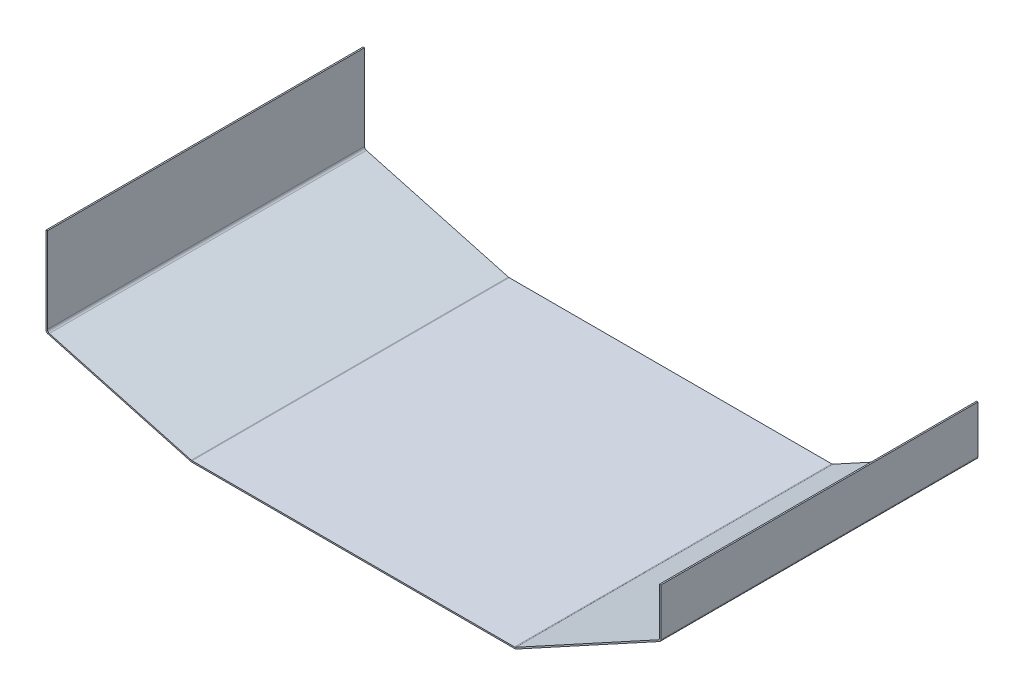
ISO-10303-21;
HEADER;
FILE_DESCRIPTION(('STEP AP214'),'2;1');
FILE_NAME('part.step','',(''),(''),'','','');
FILE_SCHEMA(('AUTOMOTIVE_DESIGN { 1 0 10303 214 1 1 1 1 }'));
ENDSEC;
DATA;
#1=APPLICATION_CONTEXT('core data for automotive mechanical design processes');
#2=APPLICATION_PROTOCOL_DEFINITION('international standard','automotive_design',2000,#1);
#3=PRODUCT_CONTEXT('',#1,'mechanical');
#4=PRODUCT('Part','Part','',(#3));
#5=PRODUCT_RELATED_PRODUCT_CATEGORY('part','',(#4));
#6=PRODUCT_DEFINITION_FORMATION('','',#4);
#7=PRODUCT_DEFINITION_CONTEXT('part definition',#1,'design');
#8=PRODUCT_DEFINITION('design','',#6,#7);
#9=PRODUCT_DEFINITION_SHAPE('','',#8);
#10=(LENGTH_UNIT() NAMED_UNIT(*) SI_UNIT(.MILLI.,.METRE.));
#11=(NAMED_UNIT(*) PLANE_ANGLE_UNIT() SI_UNIT($,.RADIAN.));
#12=(NAMED_UNIT(*) SI_UNIT($,.STERADIAN.) SOLID_ANGLE_UNIT());
#13=UNCERTAINTY_MEASURE_WITH_UNIT(LENGTH_MEASURE(1.E-05),#10,'distance_accuracy_value','');
#14=(GEOMETRIC_REPRESENTATION_CONTEXT(3) GLOBAL_UNCERTAINTY_ASSIGNED_CONTEXT((#13)) GLOBAL_UNIT_ASSIGNED_CONTEXT((#10,
#11,#12)) REPRESENTATION_CONTEXT('',''));
#15=CARTESIAN_POINT('',(0.,0.,0.));
#16=DIRECTION('',(0.,0.,1.));
#17=DIRECTION('',(1.,0.,0.));
#18=AXIS2_PLACEMENT_3D('',#15,#16,#17);
#19=CARTESIAN_POINT('',(701.5875,-55.,1080.99170660759));
#20=DIRECTION('',(-1.,0.,0.));
#21=DIRECTION('',(0.,0.,1.));
#22=AXIS2_PLACEMENT_3D('',#19,#20,#21);
#23=PLANE('',#22);
#24=DIRECTION('',(0.,1.,0.));
#25=VECTOR('',#24,1.);
#26=CARTESIAN_POINT('',(701.5875,-55.,362.7));
#27=LINE('',#26,#25);
#28=CARTESIAN_POINT('',(701.5875,-54.1614932480295,362.7));
#29=VERTEX_POINT('',#28);
#30=CARTESIAN_POINT('',(701.5875,0.,362.7));
#31=VERTEX_POINT('',#30);
#32=EDGE_CURVE('E169',#29,#31,#27,.T.);
#33=ORIENTED_EDGE('',*,*,#32,.F.);
#34=DIRECTION('',(0.,0.,-1.));
#35=VECTOR('',#34,1.);
#36=CARTESIAN_POINT('',(701.5875,-54.1614932480295,1080.99170660759));
#37=LINE('',#36,#35);
#38=CARTESIAN_POINT('',(701.5875,-54.1614932480295,0.));
#39=VERTEX_POINT('',#38);
#40=EDGE_CURVE('E217',#29,#39,#37,.T.);
#41=ORIENTED_EDGE('',*,*,#40,.T.);
#42=DIRECTION('',(0.,1.,0.));
#43=VECTOR('',#42,1.);
#44=CARTESIAN_POINT('',(701.5875,-55.,0.));
#45=LINE('',#44,#43);
#46=CARTESIAN_POINT('',(701.5875,0.,0.));
#47=VERTEX_POINT('',#46);
#48=EDGE_CURVE('E193',#39,#47,#45,.T.);
#49=ORIENTED_EDGE('',*,*,#48,.T.);
#50=DIRECTION('',(0.,0.,-1.));
#51=VECTOR('',#50,1.);
#52=CARTESIAN_POINT('',(701.5875,0.,1080.99170660759));
#53=LINE('',#52,#51);
#54=EDGE_CURVE('E189',#31,#47,#53,.T.);
#55=ORIENTED_EDGE('',*,*,#54,.F.);
#56=EDGE_LOOP('',(#33,#41,#49,#55));
#57=FACE_BOUND('',#56,.T.);
#58=ADVANCED_FACE('F32',(#57),#23,.F.);
#59=CARTESIAN_POINT('',(700.,0.,1080.99170660759));
#60=DIRECTION('',(0.,1.,0.));
#61=DIRECTION('',(0.,0.,1.));
#62=AXIS2_PLACEMENT_3D('',#59,#60,#61);
#63=PLANE('',#62);
#64=DIRECTION('',(0.,0.,-1.));
#65=VECTOR('',#64,1.);
#66=CARTESIAN_POINT('',(700.,0.,1080.99170660759));
#67=LINE('',#66,#65);
#68=CARTESIAN_POINT('',(700.,0.,362.7));
#69=VERTEX_POINT('',#68);
#70=CARTESIAN_POINT('',(700.,0.,0.));
#71=VERTEX_POINT('',#70);
#72=EDGE_CURVE('E192',#69,#71,#67,.T.);
#73=ORIENTED_EDGE('',*,*,#72,.F.);
#74=DIRECTION('',(1.,0.,0.));
#75=VECTOR('',#74,1.);
#76=CARTESIAN_POINT('',(700.,0.,362.7));
#77=LINE('',#76,#75);
#78=EDGE_CURVE('E174',#69,#31,#77,.T.);
#79=ORIENTED_EDGE('',*,*,#78,.T.);
#80=ORIENTED_EDGE('',*,*,#54,.T.);
#81=DIRECTION('',(1.,0.,0.));
#82=VECTOR('',#81,1.);
#83=CARTESIAN_POINT('',(700.,0.,0.));
#84=LINE('',#83,#82);
#85=EDGE_CURVE('E327',#71,#47,#84,.T.);
#86=ORIENTED_EDGE('',*,*,#85,.F.);
#87=EDGE_LOOP('',(#73,#79,#80,#86));
#88=FACE_BOUND('',#87,.T.);
#89=ADVANCED_FACE('F187',(#88),#63,.T.);
#90=CARTESIAN_POINT('',(700.,-55.,1080.99170660759));
#91=DIRECTION('',(-1.,0.,0.));
#92=DIRECTION('',(0.,0.,1.));
#93=AXIS2_PLACEMENT_3D('',#90,#91,#92);
#94=PLANE('',#93);
#95=DIRECTION('',(0.,1.,0.));
#96=VECTOR('',#95,1.);
#97=CARTESIAN_POINT('',(700.,-55.,0.));
#98=LINE('',#97,#96);
#99=CARTESIAN_POINT('',(700.,-53.2191007037795,0.));
#100=VERTEX_POINT('',#99);
#101=EDGE_CURVE('E323',#100,#71,#98,.T.);
#102=ORIENTED_EDGE('',*,*,#101,.F.);
#103=DIRECTION('',(0.,0.,-1.));
#104=VECTOR('',#103,1.);
#105=CARTESIAN_POINT('',(700.,-53.2191007037795,362.7));
#106=LINE('',#105,#104);
#107=CARTESIAN_POINT('',(700.,-53.2191007037795,362.7));
#108=VERTEX_POINT('',#107);
#109=EDGE_CURVE('E215',#100,#108,#106,.F.);
#110=ORIENTED_EDGE('',*,*,#109,.T.);
#111=DIRECTION('',(0.,1.,0.));
#112=VECTOR('',#111,1.);
#113=CARTESIAN_POINT('',(700.,-55.,362.7));
#114=LINE('',#113,#112);
#115=EDGE_CURVE('E196',#108,#69,#114,.T.);
#116=ORIENTED_EDGE('',*,*,#115,.T.);
#117=ORIENTED_EDGE('',*,*,#72,.T.);
#118=EDGE_LOOP('',(#102,#110,#116,#117));
#119=FACE_BOUND('',#118,.T.);
#120=ADVANCED_FACE('F326',(#119),#94,.T.);
#121=CARTESIAN_POINT('',(535.,-145.,1080.99170660759));
#122=DIRECTION('',(-0.478852130680573,0.877895572914385,0.));
#123=DIRECTION('',(-0.877895572914384,-0.478852130680573,0.));
#124=AXIS2_PLACEMENT_3D('',#121,#122,#123);
#125=PLANE('',#124);
#126=DIRECTION('',(0.877895572914384,0.478852130680573,0.));
#127=VECTOR('',#126,1.);
#128=CARTESIAN_POINT('',(535.,-145.,362.7));
#129=LINE('',#128,#127);
#130=CARTESIAN_POINT('',(535.671574348971,-144.633686718743,362.7));
#131=VERTEX_POINT('',#130);
#132=CARTESIAN_POINT('',(698.436556392042,-55.8527874225227,362.7));
#133=VERTEX_POINT('',#132);
#134=EDGE_CURVE('E202',#131,#133,#129,.T.);
#135=ORIENTED_EDGE('',*,*,#134,.T.);
#136=DIRECTION('',(0.,0.,-1.));
#137=VECTOR('',#136,1.);
#138=CARTESIAN_POINT('',(698.436556392042,-55.8527874225227,0.));
#139=LINE('',#138,#137);
#140=CARTESIAN_POINT('',(698.436556392042,-55.8527874225226,0.));
#141=VERTEX_POINT('',#140);
#142=EDGE_CURVE('E211',#133,#141,#139,.T.);
#143=ORIENTED_EDGE('',*,*,#142,.T.);
#144=DIRECTION('',(0.877895572914385,0.478852130680573,0.));
#145=VECTOR('',#144,1.);
#146=CARTESIAN_POINT('',(535.,-145.,0.));
#147=LINE('',#146,#145);
#148=CARTESIAN_POINT('',(535.671574348971,-144.633686718743,0.));
#149=VERTEX_POINT('',#148);
#150=EDGE_CURVE('E324',#149,#141,#147,.T.);
#151=ORIENTED_EDGE('',*,*,#150,.F.);
#152=DIRECTION('',(0.,0.,-1.));
#153=VECTOR('',#152,1.);
#154=CARTESIAN_POINT('',(535.671574348971,-144.633686718743,362.7));
#155=LINE('',#154,#153);
#156=EDGE_CURVE('E209',#149,#131,#155,.F.);
#157=ORIENTED_EDGE('',*,*,#156,.T.);
#158=EDGE_LOOP('',(#135,#143,#151,#157));
#159=FACE_BOUND('',#158,.T.);
#160=ADVANCED_FACE('F313',(#159),#125,.T.);
#161=CARTESIAN_POINT('',(165.,-145.,1080.99170660759));
#162=DIRECTION('',(0.,1.,0.));
#163=DIRECTION('',(0.,0.,1.));
#164=AXIS2_PLACEMENT_3D('',#161,#162,#163);
#165=PLANE('',#164);
#166=DIRECTION('',(1.,0.,0.));
#167=VECTOR('',#166,1.);
#168=CARTESIAN_POINT('',(165.,-145.,362.7));
#169=LINE('',#168,#167);
#170=CARTESIAN_POINT('',(165.401754250991,-145.,362.7));
#171=VERTEX_POINT('',#170);
#172=CARTESIAN_POINT('',(534.235017956929,-145.,362.7));
#173=VERTEX_POINT('',#172);
#174=EDGE_CURVE('E303',#171,#173,#169,.T.);
#175=ORIENTED_EDGE('',*,*,#174,.T.);
#176=DIRECTION('',(0.,0.,-1.));
#177=VECTOR('',#176,1.);
#178=CARTESIAN_POINT('',(534.235017956929,-145.,4.44089209850063E-13));
#179=LINE('',#178,#177);
#180=CARTESIAN_POINT('',(534.235017956929,-145.,0.));
#181=VERTEX_POINT('',#180);
#182=EDGE_CURVE('E244',#173,#181,#179,.T.);
#183=ORIENTED_EDGE('',*,*,#182,.T.);
#184=DIRECTION('',(1.,0.,0.));
#185=VECTOR('',#184,1.);
#186=CARTESIAN_POINT('',(165.,-145.,0.));
#187=LINE('',#186,#185);
#188=CARTESIAN_POINT('',(165.401754250991,-145.,0.));
#189=VERTEX_POINT('',#188);
#190=EDGE_CURVE('E290',#189,#181,#187,.T.);
#191=ORIENTED_EDGE('',*,*,#190,.F.);
#192=DIRECTION('',(0.,0.,-1.));
#193=VECTOR('',#192,1.);
#194=CARTESIAN_POINT('',(165.401754250991,-145.,362.7));
#195=LINE('',#194,#193);
#196=EDGE_CURVE('E242',#189,#171,#195,.F.);
#197=ORIENTED_EDGE('',*,*,#196,.T.);
#198=EDGE_LOOP('',(#175,#183,#191,#197));
#199=FACE_BOUND('',#198,.T.);
#200=ADVANCED_FACE('F367',(#199),#165,.T.);
#201=CARTESIAN_POINT('',(0.,-100.,1080.99170660759));
#202=DIRECTION('',(0.263117405792109,0.964763821237732,0.));
#203=DIRECTION('',(-0.964763821237732,0.263117405792109,0.));
#204=AXIS2_PLACEMENT_3D('',#201,#202,#203);
#205=PLANE('',#204);
#206=DIRECTION('',(0.964763821237732,-0.263117405792109,0.));
#207=VECTOR('',#206,1.);
#208=CARTESIAN_POINT('',(0.,-100.,362.7));
#209=LINE('',#208,#207);
#210=CARTESIAN_POINT('',(2.21064778262369,-100.602903940716,362.7));
#211=VERTEX_POINT('',#210);
#212=CARTESIAN_POINT('',(164.612402033615,-144.894291463713,362.7));
#213=VERTEX_POINT('',#212);
#214=EDGE_CURVE('E297',#211,#213,#209,.T.);
#215=ORIENTED_EDGE('',*,*,#214,.T.);
#216=DIRECTION('',(0.,0.,-1.));
#217=VECTOR('',#216,1.);
#218=CARTESIAN_POINT('',(164.612402033615,-144.894291463713,0.));
#219=LINE('',#218,#217);
#220=CARTESIAN_POINT('',(164.612402033615,-144.894291463713,0.));
#221=VERTEX_POINT('',#220);
#222=EDGE_CURVE('E249',#213,#221,#219,.T.);
#223=ORIENTED_EDGE('',*,*,#222,.T.);
#224=DIRECTION('',(0.964763821237732,-0.263117405792109,0.));
#225=VECTOR('',#224,1.);
#226=CARTESIAN_POINT('',(0.,-100.,0.));
#227=LINE('',#226,#225);
#228=CARTESIAN_POINT('',(2.21064778262369,-100.602903940716,0.));
#229=VERTEX_POINT('',#228);
#230=EDGE_CURVE('E278',#229,#221,#227,.T.);
#231=ORIENTED_EDGE('',*,*,#230,.F.);
#232=DIRECTION('',(0.,0.,-1.));
#233=VECTOR('',#232,1.);
#234=CARTESIAN_POINT('',(2.21064778262369,-100.602903940716,362.7));
#235=LINE('',#234,#233);
#236=EDGE_CURVE('E247',#229,#211,#235,.F.);
#237=ORIENTED_EDGE('',*,*,#236,.T.);
#238=EDGE_LOOP('',(#215,#223,#231,#237));
#239=FACE_BOUND('',#238,.T.);
#240=ADVANCED_FACE('F287',(#239),#205,.T.);
#241=CARTESIAN_POINT('',(0.,0.,1080.99170660759));
#242=DIRECTION('',(1.,0.,0.));
#243=DIRECTION('',(0.,1.,0.));
#244=AXIS2_PLACEMENT_3D('',#241,#242,#243);
#245=PLANE('',#244);
#246=DIRECTION('',(0.,-1.,0.));
#247=VECTOR('',#246,1.);
#248=CARTESIAN_POINT('',(0.,0.,362.7));
#249=LINE('',#248,#247);
#250=CARTESIAN_POINT('',(0.,0.,362.7));
#251=VERTEX_POINT('',#250);
#252=CARTESIAN_POINT('',(0.,-97.7086124770024,362.7));
#253=VERTEX_POINT('',#252);
#254=EDGE_CURVE('E296',#251,#253,#249,.T.);
#255=ORIENTED_EDGE('',*,*,#254,.T.);
#256=DIRECTION('',(0.,0.,-1.));
#257=VECTOR('',#256,1.);
#258=CARTESIAN_POINT('',(0.,-97.7086124770024,0.));
#259=LINE('',#258,#257);
#260=CARTESIAN_POINT('',(0.,-97.7086124770024,0.));
#261=VERTEX_POINT('',#260);
#262=EDGE_CURVE('E259',#253,#261,#259,.T.);
#263=ORIENTED_EDGE('',*,*,#262,.T.);
#264=DIRECTION('',(0.,-1.,0.));
#265=VECTOR('',#264,1.);
#266=CARTESIAN_POINT('',(0.,0.,0.));
#267=LINE('',#266,#265);
#268=CARTESIAN_POINT('',(0.,0.,0.));
#269=VERTEX_POINT('',#268);
#270=EDGE_CURVE('E281',#269,#261,#267,.T.);
#271=ORIENTED_EDGE('',*,*,#270,.F.);
#272=DIRECTION('',(0.,0.,-1.));
#273=VECTOR('',#272,1.);
#274=CARTESIAN_POINT('',(0.,0.,1080.99170660759));
#275=LINE('',#274,#273);
#276=EDGE_CURVE('E203',#251,#269,#275,.T.);
#277=ORIENTED_EDGE('',*,*,#276,.F.);
#278=EDGE_LOOP('',(#255,#263,#271,#277));
#279=FACE_BOUND('',#278,.T.);
#280=ADVANCED_FACE('F300',(#279),#245,.T.);
#281=CARTESIAN_POINT('',(-1.5875,0.,1080.99170660759));
#282=DIRECTION('',(0.,1.,0.));
#283=DIRECTION('',(-1.,0.,0.));
#284=AXIS2_PLACEMENT_3D('',#281,#282,#283);
#285=PLANE('',#284);
#286=DIRECTION('',(0.,0.,-1.));
#287=VECTOR('',#286,1.);
#288=CARTESIAN_POINT('',(-1.5875,0.,1080.99170660759));
#289=LINE('',#288,#287);
#290=CARTESIAN_POINT('',(-1.5875,0.,362.7));
#291=VERTEX_POINT('',#290);
#292=CARTESIAN_POINT('',(-1.5875,0.,0.));
#293=VERTEX_POINT('',#292);
#294=EDGE_CURVE('E205',#291,#293,#289,.T.);
#295=ORIENTED_EDGE('',*,*,#294,.F.);
#296=DIRECTION('',(1.,0.,0.));
#297=VECTOR('',#296,1.);
#298=CARTESIAN_POINT('',(-1.5875,0.,362.7));
#299=LINE('',#298,#297);
#300=EDGE_CURVE('E206',#291,#251,#299,.T.);
#301=ORIENTED_EDGE('',*,*,#300,.T.);
#302=ORIENTED_EDGE('',*,*,#276,.T.);
#303=DIRECTION('',(1.,0.,0.));
#304=VECTOR('',#303,1.);
#305=CARTESIAN_POINT('',(-1.5875,0.,0.));
#306=LINE('',#305,#304);
#307=EDGE_CURVE('E361',#293,#269,#306,.T.);
#308=ORIENTED_EDGE('',*,*,#307,.F.);
#309=EDGE_LOOP('',(#295,#301,#302,#308));
#310=FACE_BOUND('',#309,.T.);
#311=ADVANCED_FACE('F506',(#310),#285,.T.);
#312=CARTESIAN_POINT('',(-1.5875,0.,1080.99170660759));
#313=DIRECTION('',(1.,0.,0.));
#314=DIRECTION('',(0.,1.,0.));
#315=AXIS2_PLACEMENT_3D('',#312,#313,#314);
#316=PLANE('',#315);
#317=DIRECTION('',(0.,-1.,0.));
#318=VECTOR('',#317,1.);
#319=CARTESIAN_POINT('',(-1.5875,0.,0.));
#320=LINE('',#319,#318);
#321=CARTESIAN_POINT('',(-1.58749999999999,-98.9211383745886,0.));
#322=VERTEX_POINT('',#321);
#323=EDGE_CURVE('E208',#293,#322,#320,.T.);
#324=ORIENTED_EDGE('',*,*,#323,.T.);
#325=DIRECTION('',(0.,0.,-1.));
#326=VECTOR('',#325,1.);
#327=CARTESIAN_POINT('',(-1.58749999999999,-98.9211383745886,1080.99170660759));
#328=LINE('',#327,#326);
#329=CARTESIAN_POINT('',(-1.58749999999999,-98.9211383745886,362.7));
#330=VERTEX_POINT('',#329);
#331=EDGE_CURVE('E257',#322,#330,#328,.F.);
#332=ORIENTED_EDGE('',*,*,#331,.T.);
#333=DIRECTION('',(0.,-1.,0.));
#334=VECTOR('',#333,1.);
#335=CARTESIAN_POINT('',(-1.5875,0.,362.7));
#336=LINE('',#335,#334);
#337=EDGE_CURVE('E181',#291,#330,#336,.T.);
#338=ORIENTED_EDGE('',*,*,#337,.F.);
#339=ORIENTED_EDGE('',*,*,#294,.T.);
#340=EDGE_LOOP('',(#324,#332,#338,#339));
#341=FACE_BOUND('',#340,.T.);
#342=ADVANCED_FACE('F497',(#341),#316,.F.);
#343=CARTESIAN_POINT('',(-0.41769888169496,-101.531562566215,1080.99170660759));
#344=DIRECTION('',(0.263117405792109,0.964763821237732,0.));
#345=DIRECTION('',(-0.964763821237732,0.263117405792109,0.));
#346=AXIS2_PLACEMENT_3D('',#343,#344,#345);
#347=PLANE('',#346);
#348=DIRECTION('',(0.964763821237732,-0.263117405792109,0.));
#349=VECTOR('',#348,1.);
#350=CARTESIAN_POINT('',(-0.41769888169496,-101.531562566215,0.));
#351=LINE('',#350,#349);
#352=CARTESIAN_POINT('',(0.623147782623684,-101.815429838302,0.));
#353=VERTEX_POINT('',#352);
#354=CARTESIAN_POINT('',(164.399807075799,-146.481791463713,0.));
#355=VERTEX_POINT('',#354);
#356=EDGE_CURVE('E349',#353,#355,#351,.T.);
#357=ORIENTED_EDGE('',*,*,#356,.T.);
#358=DIRECTION('',(0.,0.,-1.));
#359=VECTOR('',#358,1.);
#360=CARTESIAN_POINT('',(164.399807075799,-146.481791463713,1080.99170660759));
#361=LINE('',#360,#359);
#362=CARTESIAN_POINT('',(164.399807075799,-146.481791463713,362.7));
#363=VERTEX_POINT('',#362);
#364=EDGE_CURVE('E255',#355,#363,#361,.F.);
#365=ORIENTED_EDGE('',*,*,#364,.T.);
#366=DIRECTION('',(0.964763821237732,-0.263117405792109,0.));
#367=VECTOR('',#366,1.);
#368=CARTESIAN_POINT('',(-0.41769888169496,-101.531562566215,362.7));
#369=LINE('',#368,#367);
#370=CARTESIAN_POINT('',(0.623147782623684,-101.815429838302,362.7));
#371=VERTEX_POINT('',#370);
#372=EDGE_CURVE('E335',#371,#363,#369,.T.);
#373=ORIENTED_EDGE('',*,*,#372,.F.);
#374=DIRECTION('',(0.,0.,-1.));
#375=VECTOR('',#374,1.);
#376=CARTESIAN_POINT('',(0.623147782623684,-101.815429838302,1080.99170660759));
#377=LINE('',#376,#375);
#378=EDGE_CURVE('E252',#371,#353,#377,.T.);
#379=ORIENTED_EDGE('',*,*,#378,.T.);
#380=EDGE_LOOP('',(#357,#365,#373,#379));
#381=FACE_BOUND('',#380,.T.);
#382=ADVANCED_FACE('F348',(#381),#347,.F.);
#383=CARTESIAN_POINT('',(165.,-146.5875,1080.99170660759));
#384=DIRECTION('',(0.,1.,0.));
#385=DIRECTION('',(0.,0.,1.));
#386=AXIS2_PLACEMENT_3D('',#383,#384,#385);
#387=PLANE('',#386);
#388=DIRECTION('',(1.,0.,0.));
#389=VECTOR('',#388,1.);
#390=CARTESIAN_POINT('',(165.,-146.5875,0.));
#391=LINE('',#390,#389);
#392=CARTESIAN_POINT('',(165.189159293175,-146.5875,0.));
#393=VERTEX_POINT('',#392);
#394=CARTESIAN_POINT('',(534.639820954721,-146.5875,0.));
#395=VERTEX_POINT('',#394);
#396=EDGE_CURVE('E354',#393,#395,#391,.T.);
#397=ORIENTED_EDGE('',*,*,#396,.T.);
#398=DIRECTION('',(0.,0.,-1.));
#399=VECTOR('',#398,1.);
#400=CARTESIAN_POINT('',(534.639820954721,-146.5875,1080.99170660759));
#401=LINE('',#400,#399);
#402=CARTESIAN_POINT('',(534.639820954721,-146.5875,362.7));
#403=VERTEX_POINT('',#402);
#404=EDGE_CURVE('E47',#395,#403,#401,.F.);
#405=ORIENTED_EDGE('',*,*,#404,.T.);
#406=DIRECTION('',(1.,0.,0.));
#407=VECTOR('',#406,1.);
#408=CARTESIAN_POINT('',(165.,-146.5875,362.7));
#409=LINE('',#408,#407);
#410=CARTESIAN_POINT('',(165.189159293175,-146.5875,362.7));
#411=VERTEX_POINT('',#410);
#412=EDGE_CURVE('E212',#411,#403,#409,.T.);
#413=ORIENTED_EDGE('',*,*,#412,.F.);
#414=DIRECTION('',(0.,0.,-1.));
#415=VECTOR('',#414,1.);
#416=CARTESIAN_POINT('',(165.189159293175,-146.5875,1080.99170660759));
#417=LINE('',#416,#415);
#418=EDGE_CURVE('E238',#411,#393,#417,.T.);
#419=ORIENTED_EDGE('',*,*,#418,.T.);
#420=EDGE_LOOP('',(#397,#405,#413,#419));
#421=FACE_BOUND('',#420,.T.);
#422=ADVANCED_FACE('F411',(#421),#387,.F.);
#423=CARTESIAN_POINT('',(535.760177757455,-146.393659222002,1080.99170660759));
#424=DIRECTION('',(-0.478852130680573,0.877895572914384,0.));
#425=DIRECTION('',(-0.877895572914384,-0.478852130680573,0.));
#426=AXIS2_PLACEMENT_3D('',#423,#424,#425);
#427=PLANE('',#426);
#428=DIRECTION('',(0.877895572914384,0.478852130680573,0.));
#429=VECTOR('',#428,1.);
#430=CARTESIAN_POINT('',(535.760177757455,-146.393659222002,0.));
#431=LINE('',#430,#429);
#432=CARTESIAN_POINT('',(536.076377346762,-146.221186718743,0.));
#433=VERTEX_POINT('',#432);
#434=CARTESIAN_POINT('',(700.024056392042,-56.7951799667727,0.));
#435=VERTEX_POINT('',#434);
#436=EDGE_CURVE('E356',#433,#435,#431,.T.);
#437=ORIENTED_EDGE('',*,*,#436,.T.);
#438=DIRECTION('',(0.,0.,-1.));
#439=VECTOR('',#438,1.);
#440=CARTESIAN_POINT('',(700.024056392042,-56.7951799667727,1080.99170660759));
#441=LINE('',#440,#439);
#442=CARTESIAN_POINT('',(700.024056392042,-56.7951799667727,362.7));
#443=VERTEX_POINT('',#442);
#444=EDGE_CURVE('E230',#435,#443,#441,.F.);
#445=ORIENTED_EDGE('',*,*,#444,.T.);
#446=DIRECTION('',(0.877895572914384,0.478852130680573,0.));
#447=VECTOR('',#446,1.);
#448=CARTESIAN_POINT('',(535.760177757455,-146.393659222002,362.7));
#449=LINE('',#448,#447);
#450=CARTESIAN_POINT('',(536.076377346762,-146.221186718743,362.7));
#451=VERTEX_POINT('',#450);
#452=EDGE_CURVE('E182',#451,#443,#449,.T.);
#453=ORIENTED_EDGE('',*,*,#452,.F.);
#454=DIRECTION('',(0.,0.,-1.));
#455=VECTOR('',#454,1.);
#456=CARTESIAN_POINT('',(536.076377346762,-146.221186718743,1080.99170660759));
#457=LINE('',#456,#455);
#458=EDGE_CURVE('E227',#451,#433,#457,.T.);
#459=ORIENTED_EDGE('',*,*,#458,.T.);
#460=EDGE_LOOP('',(#437,#445,#453,#459));
#461=FACE_BOUND('',#460,.T.);
#462=ADVANCED_FACE('F407',(#461),#427,.F.);
#463=CARTESIAN_POINT('',(0.,0.,0.));
#464=DIRECTION('',(0.,0.,-1.));
#465=DIRECTION('',(-1.,0.,0.));
#466=AXIS2_PLACEMENT_3D('',#463,#464,#465);
#467=PLANE('',#466);
#468=ORIENTED_EDGE('',*,*,#48,.F.);
#469=CARTESIAN_POINT('',(698.5875,-54.1614932480295,0.));
#470=DIRECTION('',(0.,0.,-1.));
#471=DIRECTION('',(-1.,0.,0.));
#472=AXIS2_PLACEMENT_3D('',#469,#470,#471);
#473=CIRCLE('',#472,3.);
#474=EDGE_CURVE('E225',#39,#435,#473,.T.);
#475=ORIENTED_EDGE('',*,*,#474,.T.);
#476=ORIENTED_EDGE('',*,*,#436,.F.);
#477=CARTESIAN_POINT('',(534.639820954721,-143.5875,0.));
#478=DIRECTION('',(0.,0.,-1.));
#479=DIRECTION('',(-1.,0.,0.));
#480=AXIS2_PLACEMENT_3D('',#477,#478,#479);
#481=CIRCLE('',#480,3.);
#482=EDGE_CURVE('E223',#433,#395,#481,.T.);
#483=ORIENTED_EDGE('',*,*,#482,.T.);
#484=ORIENTED_EDGE('',*,*,#396,.F.);
#485=CARTESIAN_POINT('',(165.189159293175,-143.5875,0.));
#486=DIRECTION('',(0.,0.,-1.));
#487=DIRECTION('',(-1.,0.,0.));
#488=AXIS2_PLACEMENT_3D('',#485,#486,#487);
#489=CIRCLE('',#488,3.);
#490=EDGE_CURVE('E221',#393,#355,#489,.T.);
#491=ORIENTED_EDGE('',*,*,#490,.T.);
#492=ORIENTED_EDGE('',*,*,#356,.F.);
#493=CARTESIAN_POINT('',(1.41250000000001,-98.9211383745886,0.));
#494=DIRECTION('',(0.,0.,-1.));
#495=DIRECTION('',(-1.,0.,0.));
#496=AXIS2_PLACEMENT_3D('',#493,#494,#495);
#497=CIRCLE('',#496,3.);
#498=EDGE_CURVE('E219',#353,#322,#497,.T.);
#499=ORIENTED_EDGE('',*,*,#498,.T.);
#500=ORIENTED_EDGE('',*,*,#323,.F.);
#501=ORIENTED_EDGE('',*,*,#307,.T.);
#502=ORIENTED_EDGE('',*,*,#270,.T.);
#503=CARTESIAN_POINT('',(3.00000000000001,-97.7086124770024,0.));
#504=DIRECTION('',(0.,0.,-1.));
#505=DIRECTION('',(-1.,0.,0.));
#506=AXIS2_PLACEMENT_3D('',#503,#504,#505);
#507=CIRCLE('',#506,3.);
#508=EDGE_CURVE('E40',#261,#229,#507,.F.);
#509=ORIENTED_EDGE('',*,*,#508,.T.);
#510=ORIENTED_EDGE('',*,*,#230,.T.);
#511=CARTESIAN_POINT('',(165.401754250991,-142.,0.));
#512=DIRECTION('',(0.,0.,-1.));
#513=DIRECTION('',(-1.,0.,0.));
#514=AXIS2_PLACEMENT_3D('',#511,#512,#513);
#515=CIRCLE('',#514,3.);
#516=EDGE_CURVE('E270',#221,#189,#515,.F.);
#517=ORIENTED_EDGE('',*,*,#516,.T.);
#518=ORIENTED_EDGE('',*,*,#190,.T.);
#519=CARTESIAN_POINT('',(534.235017956929,-142.,0.));
#520=DIRECTION('',(0.,0.,-1.));
#521=DIRECTION('',(-1.,0.,0.));
#522=AXIS2_PLACEMENT_3D('',#519,#520,#521);
#523=CIRCLE('',#522,3.);
#524=EDGE_CURVE('E266',#181,#149,#523,.F.);
#525=ORIENTED_EDGE('',*,*,#524,.T.);
#526=ORIENTED_EDGE('',*,*,#150,.T.);
#527=CARTESIAN_POINT('',(697.,-53.2191007037795,0.));
#528=DIRECTION('',(0.,0.,-1.));
#529=DIRECTION('',(-1.,0.,0.));
#530=AXIS2_PLACEMENT_3D('',#527,#528,#529);
#531=CIRCLE('',#530,3.);
#532=EDGE_CURVE('E262',#141,#100,#531,.F.);
#533=ORIENTED_EDGE('',*,*,#532,.T.);
#534=ORIENTED_EDGE('',*,*,#101,.T.);
#535=ORIENTED_EDGE('',*,*,#85,.T.);
#536=EDGE_LOOP('',(#468,#475,#476,#483,#484,#491,#492,#499,#500,#501,#502,#509,#510,#517,#518,
#525,#526,#533,#534,#535));
#537=FACE_BOUND('',#536,.T.);
#538=ADVANCED_FACE('F277',(#537),#467,.T.);
#539=CARTESIAN_POINT('',(697.,-53.2191007037795,362.7));
#540=DIRECTION('',(0.,0.,1.));
#541=DIRECTION('',(1.,0.,0.));
#542=AXIS2_PLACEMENT_3D('',#539,#540,#541);
#543=PLANE('',#542);
#544=ORIENTED_EDGE('',*,*,#452,.T.);
#545=CARTESIAN_POINT('',(698.5875,-54.1614932480295,362.7));
#546=DIRECTION('',(0.,0.,1.));
#547=DIRECTION('',(1.,0.,0.));
#548=AXIS2_PLACEMENT_3D('',#545,#546,#547);
#549=CIRCLE('',#548,3.);
#550=EDGE_CURVE('E176',#443,#29,#549,.T.);
#551=ORIENTED_EDGE('',*,*,#550,.T.);
#552=ORIENTED_EDGE('',*,*,#32,.T.);
#553=ORIENTED_EDGE('',*,*,#78,.F.);
#554=ORIENTED_EDGE('',*,*,#115,.F.);
#555=CARTESIAN_POINT('',(697.,-53.2191007037795,362.7));
#556=DIRECTION('',(0.,0.,1.));
#557=DIRECTION('',(1.,0.,0.));
#558=AXIS2_PLACEMENT_3D('',#555,#556,#557);
#559=CIRCLE('',#558,3.);
#560=EDGE_CURVE('E264',#108,#133,#559,.F.);
#561=ORIENTED_EDGE('',*,*,#560,.T.);
#562=ORIENTED_EDGE('',*,*,#134,.F.);
#563=CARTESIAN_POINT('',(534.235017956929,-142.,362.7));
#564=DIRECTION('',(0.,0.,1.));
#565=DIRECTION('',(1.,0.,0.));
#566=AXIS2_PLACEMENT_3D('',#563,#564,#565);
#567=CIRCLE('',#566,3.);
#568=EDGE_CURVE('E268',#131,#173,#567,.F.);
#569=ORIENTED_EDGE('',*,*,#568,.T.);
#570=ORIENTED_EDGE('',*,*,#174,.F.);
#571=CARTESIAN_POINT('',(165.401754250991,-142.,362.7));
#572=DIRECTION('',(0.,0.,1.));
#573=DIRECTION('',(1.,0.,0.));
#574=AXIS2_PLACEMENT_3D('',#571,#572,#573);
#575=CIRCLE('',#574,3.);
#576=EDGE_CURVE('E272',#171,#213,#575,.F.);
#577=ORIENTED_EDGE('',*,*,#576,.T.);
#578=ORIENTED_EDGE('',*,*,#214,.F.);
#579=CARTESIAN_POINT('',(3.00000000000001,-97.7086124770024,362.7));
#580=DIRECTION('',(0.,0.,1.));
#581=DIRECTION('',(1.,0.,0.));
#582=AXIS2_PLACEMENT_3D('',#579,#580,#581);
#583=CIRCLE('',#582,3.);
#584=EDGE_CURVE('E11',#211,#253,#583,.F.);
#585=ORIENTED_EDGE('',*,*,#584,.T.);
#586=ORIENTED_EDGE('',*,*,#254,.F.);
#587=ORIENTED_EDGE('',*,*,#300,.F.);
#588=ORIENTED_EDGE('',*,*,#337,.T.);
#589=CARTESIAN_POINT('',(1.41250000000001,-98.9211383745886,362.7));
#590=DIRECTION('',(0.,0.,1.));
#591=DIRECTION('',(1.,0.,0.));
#592=AXIS2_PLACEMENT_3D('',#589,#590,#591);
#593=CIRCLE('',#592,3.);
#594=EDGE_CURVE('E232',#330,#371,#593,.T.);
#595=ORIENTED_EDGE('',*,*,#594,.T.);
#596=ORIENTED_EDGE('',*,*,#372,.T.);
#597=CARTESIAN_POINT('',(165.189159293175,-143.5875,362.7));
#598=DIRECTION('',(0.,0.,1.));
#599=DIRECTION('',(1.,0.,0.));
#600=AXIS2_PLACEMENT_3D('',#597,#598,#599);
#601=CIRCLE('',#600,3.);
#602=EDGE_CURVE('E54',#363,#411,#601,.T.);
#603=ORIENTED_EDGE('',*,*,#602,.T.);
#604=ORIENTED_EDGE('',*,*,#412,.T.);
#605=CARTESIAN_POINT('',(534.639820954721,-143.5875,362.7));
#606=DIRECTION('',(0.,0.,1.));
#607=DIRECTION('',(1.,0.,0.));
#608=AXIS2_PLACEMENT_3D('',#605,#606,#607);
#609=CIRCLE('',#608,3.);
#610=EDGE_CURVE('E235',#403,#451,#609,.T.);
#611=ORIENTED_EDGE('',*,*,#610,.T.);
#612=EDGE_LOOP('',(#544,#551,#552,#553,#554,#561,#562,#569,#570,#577,#578,#585,#586,#587,#588,
#595,#596,#603,#604,#611));
#613=FACE_BOUND('',#612,.T.);
#614=ADVANCED_FACE('F172',(#613),#543,.T.);
#615=CARTESIAN_POINT('',(697.,-53.2191007037795,1080.99170660759));
#616=DIRECTION('',(0.,0.,1.));
#617=DIRECTION('',(1.,0.,0.));
#618=AXIS2_PLACEMENT_3D('',#615,#616,#617);
#619=CYLINDRICAL_SURFACE('',#618,3.);
#620=ORIENTED_EDGE('',*,*,#560,.F.);
#621=ORIENTED_EDGE('',*,*,#109,.F.);
#622=ORIENTED_EDGE('',*,*,#532,.F.);
#623=ORIENTED_EDGE('',*,*,#142,.F.);
#624=EDGE_LOOP('',(#620,#621,#622,#623));
#625=FACE_BOUND('',#624,.T.);
#626=ADVANCED_FACE('F320',(#625),#619,.F.);
#627=CARTESIAN_POINT('',(698.5875,-54.1614932480295,1080.99170660759));
#628=DIRECTION('',(0.,0.,-1.));
#629=DIRECTION('',(-1.,0.,0.));
#630=AXIS2_PLACEMENT_3D('',#627,#628,#629);
#631=CYLINDRICAL_SURFACE('',#630,3.);
#632=ORIENTED_EDGE('',*,*,#550,.F.);
#633=ORIENTED_EDGE('',*,*,#444,.F.);
#634=ORIENTED_EDGE('',*,*,#474,.F.);
#635=ORIENTED_EDGE('',*,*,#40,.F.);
#636=EDGE_LOOP('',(#632,#633,#634,#635));
#637=FACE_BOUND('',#636,.T.);
#638=ADVANCED_FACE('F384',(#637),#631,.T.);
#639=CARTESIAN_POINT('',(534.639820954721,-143.5875,1080.99170660759));
#640=DIRECTION('',(0.,0.,-1.));
#641=DIRECTION('',(-1.,0.,0.));
#642=AXIS2_PLACEMENT_3D('',#639,#640,#641);
#643=CYLINDRICAL_SURFACE('',#642,3.);
#644=ORIENTED_EDGE('',*,*,#610,.F.);
#645=ORIENTED_EDGE('',*,*,#404,.F.);
#646=ORIENTED_EDGE('',*,*,#482,.F.);
#647=ORIENTED_EDGE('',*,*,#458,.F.);
#648=EDGE_LOOP('',(#644,#645,#646,#647));
#649=FACE_BOUND('',#648,.T.);
#650=ADVANCED_FACE('F376',(#649),#643,.T.);
#651=CARTESIAN_POINT('',(534.235017956929,-142.,1080.99170660759));
#652=DIRECTION('',(0.,0.,1.));
#653=DIRECTION('',(1.,0.,0.));
#654=AXIS2_PLACEMENT_3D('',#651,#652,#653);
#655=CYLINDRICAL_SURFACE('',#654,3.);
#656=ORIENTED_EDGE('',*,*,#568,.F.);
#657=ORIENTED_EDGE('',*,*,#156,.F.);
#658=ORIENTED_EDGE('',*,*,#524,.F.);
#659=ORIENTED_EDGE('',*,*,#182,.F.);
#660=EDGE_LOOP('',(#656,#657,#658,#659));
#661=FACE_BOUND('',#660,.T.);
#662=ADVANCED_FACE('F374',(#661),#655,.F.);
#663=CARTESIAN_POINT('',(165.401754250991,-142.,1080.99170660759));
#664=DIRECTION('',(0.,0.,1.));
#665=DIRECTION('',(1.,0.,0.));
#666=AXIS2_PLACEMENT_3D('',#663,#664,#665);
#667=CYLINDRICAL_SURFACE('',#666,3.);
#668=ORIENTED_EDGE('',*,*,#576,.F.);
#669=ORIENTED_EDGE('',*,*,#196,.F.);
#670=ORIENTED_EDGE('',*,*,#516,.F.);
#671=ORIENTED_EDGE('',*,*,#222,.F.);
#672=EDGE_LOOP('',(#668,#669,#670,#671));
#673=FACE_BOUND('',#672,.T.);
#674=ADVANCED_FACE('F372',(#673),#667,.F.);
#675=CARTESIAN_POINT('',(165.189159293175,-143.5875,1080.99170660759));
#676=DIRECTION('',(0.,0.,-1.));
#677=DIRECTION('',(-1.,0.,0.));
#678=AXIS2_PLACEMENT_3D('',#675,#676,#677);
#679=CYLINDRICAL_SURFACE('',#678,3.);
#680=ORIENTED_EDGE('',*,*,#602,.F.);
#681=ORIENTED_EDGE('',*,*,#364,.F.);
#682=ORIENTED_EDGE('',*,*,#490,.F.);
#683=ORIENTED_EDGE('',*,*,#418,.F.);
#684=EDGE_LOOP('',(#680,#681,#682,#683));
#685=FACE_BOUND('',#684,.T.);
#686=ADVANCED_FACE('F382',(#685),#679,.T.);
#687=CARTESIAN_POINT('',(1.41250000000001,-98.9211383745886,1080.99170660759));
#688=DIRECTION('',(0.,0.,-1.));
#689=DIRECTION('',(-1.,0.,0.));
#690=AXIS2_PLACEMENT_3D('',#687,#688,#689);
#691=CYLINDRICAL_SURFACE('',#690,3.);
#692=ORIENTED_EDGE('',*,*,#594,.F.);
#693=ORIENTED_EDGE('',*,*,#331,.F.);
#694=ORIENTED_EDGE('',*,*,#498,.F.);
#695=ORIENTED_EDGE('',*,*,#378,.F.);
#696=EDGE_LOOP('',(#692,#693,#694,#695));
#697=FACE_BOUND('',#696,.T.);
#698=ADVANCED_FACE('F344',(#697),#691,.T.);
#699=CARTESIAN_POINT('',(3.00000000000001,-97.7086124770024,1080.99170660759));
#700=DIRECTION('',(0.,0.,1.));
#701=DIRECTION('',(1.,0.,0.));
#702=AXIS2_PLACEMENT_3D('',#699,#700,#701);
#703=CYLINDRICAL_SURFACE('',#702,3.);
#704=ORIENTED_EDGE('',*,*,#584,.F.);
#705=ORIENTED_EDGE('',*,*,#236,.F.);
#706=ORIENTED_EDGE('',*,*,#508,.F.);
#707=ORIENTED_EDGE('',*,*,#262,.F.);
#708=EDGE_LOOP('',(#704,#705,#706,#707));
#709=FACE_BOUND('',#708,.T.);
#710=ADVANCED_FACE('F34',(#709),#703,.F.);
#711=CLOSED_SHELL('',(#58,#89,#120,#160,#200,#240,#280,#311,#342,#382,#422,#462,#538,#614,#626,
#638,#650,#662,#674,#686,#698,#710));
#712=MANIFOLD_SOLID_BREP('B2',#711);
#713=ADVANCED_BREP_SHAPE_REPRESENTATION('',(#18,#712),#14);
#714=SHAPE_DEFINITION_REPRESENTATION(#9,#713);
ENDSEC;
END-ISO-10303-21;
